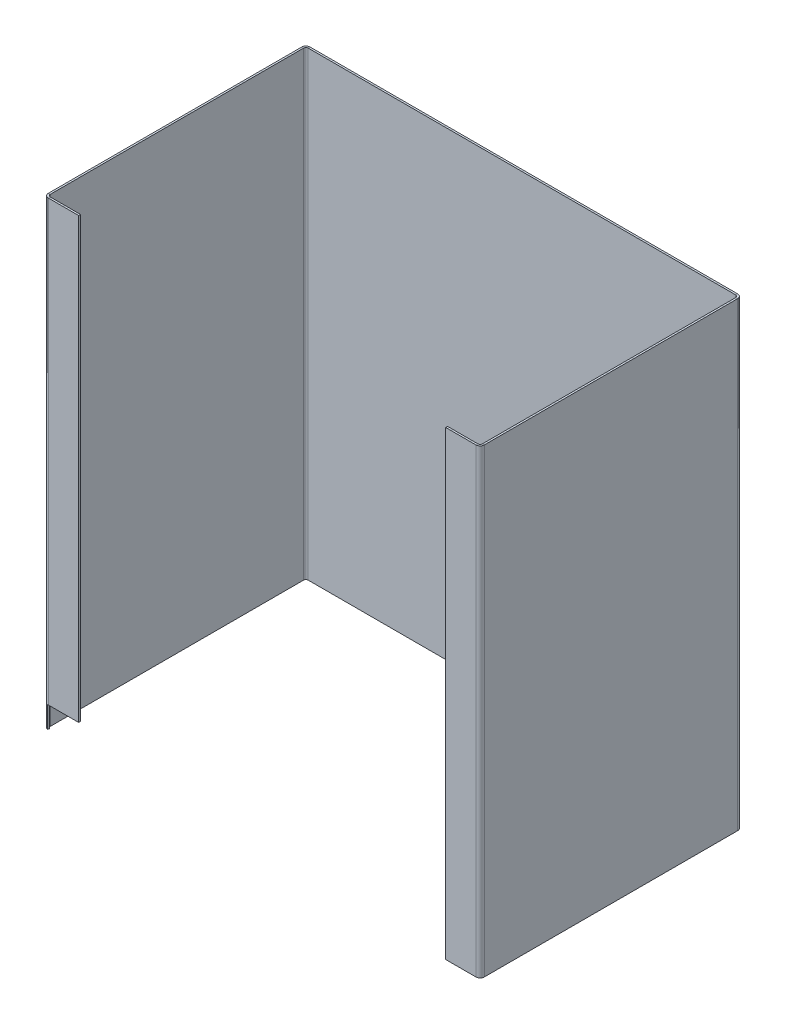
ISO-10303-21;
HEADER;
FILE_DESCRIPTION(('STEP AP214'),'2;1');
FILE_NAME('part.step','',(''),(''),'','','');
FILE_SCHEMA(('AUTOMOTIVE_DESIGN { 1 0 10303 214 1 1 1 1 }'));
ENDSEC;
DATA;
#1=APPLICATION_CONTEXT('core data for automotive mechanical design processes');
#2=APPLICATION_PROTOCOL_DEFINITION('international standard','automotive_design',2000,#1);
#3=PRODUCT_CONTEXT('',#1,'mechanical');
#4=PRODUCT('Part','Part','',(#3));
#5=PRODUCT_RELATED_PRODUCT_CATEGORY('part','',(#4));
#6=PRODUCT_DEFINITION_FORMATION('','',#4);
#7=PRODUCT_DEFINITION_CONTEXT('part definition',#1,'design');
#8=PRODUCT_DEFINITION('design','',#6,#7);
#9=PRODUCT_DEFINITION_SHAPE('','',#8);
#10=(LENGTH_UNIT() NAMED_UNIT(*) SI_UNIT(.MILLI.,.METRE.));
#11=(NAMED_UNIT(*) PLANE_ANGLE_UNIT() SI_UNIT($,.RADIAN.));
#12=(NAMED_UNIT(*) SI_UNIT($,.STERADIAN.) SOLID_ANGLE_UNIT());
#13=UNCERTAINTY_MEASURE_WITH_UNIT(LENGTH_MEASURE(1.E-05),#10,'distance_accuracy_value','');
#14=(GEOMETRIC_REPRESENTATION_CONTEXT(3) GLOBAL_UNCERTAINTY_ASSIGNED_CONTEXT((#13)) GLOBAL_UNIT_ASSIGNED_CONTEXT((#10,
#11,#12)) REPRESENTATION_CONTEXT('',''));
#15=CARTESIAN_POINT('',(0.,0.,0.));
#16=DIRECTION('',(0.,0.,1.));
#17=DIRECTION('',(1.,0.,0.));
#18=AXIS2_PLACEMENT_3D('',#15,#16,#17);
#19=CARTESIAN_POINT('',(0.,0.,0.));
#20=DIRECTION('',(0.,0.,-1.));
#21=DIRECTION('',(-1.,0.,0.));
#22=AXIS2_PLACEMENT_3D('',#19,#20,#21);
#23=PLANE('',#22);
#24=DIRECTION('',(-1.,0.,0.));
#25=VECTOR('',#24,1.);
#26=CARTESIAN_POINT('',(0.,148.,0.));
#27=LINE('',#26,#25);
#28=CARTESIAN_POINT('',(231.6634,148.,0.));
#29=VERTEX_POINT('',#28);
#30=CARTESIAN_POINT('',(94.3366,148.,0.));
#31=VERTEX_POINT('',#30);
#32=EDGE_CURVE('E378',#29,#31,#27,.T.);
#33=ORIENTED_EDGE('',*,*,#32,.F.);
#34=DIRECTION('',(0.,-1.,0.));
#35=VECTOR('',#34,1.);
#36=CARTESIAN_POINT('',(231.6634,0.,0.));
#37=LINE('',#36,#35);
#38=CARTESIAN_POINT('',(231.6634,0.,0.));
#39=VERTEX_POINT('',#38);
#40=EDGE_CURVE('E401',#29,#39,#37,.T.);
#41=ORIENTED_EDGE('',*,*,#40,.T.);
#42=DIRECTION('',(1.,0.,0.));
#43=VECTOR('',#42,1.);
#44=CARTESIAN_POINT('',(9.99999999999998,0.,0.));
#45=LINE('',#44,#43);
#46=CARTESIAN_POINT('',(94.3366,0.,0.));
#47=VERTEX_POINT('',#46);
#48=EDGE_CURVE('E410',#47,#39,#45,.T.);
#49=ORIENTED_EDGE('',*,*,#48,.F.);
#50=DIRECTION('',(0.,-1.,0.));
#51=VECTOR('',#50,1.);
#52=CARTESIAN_POINT('',(94.3366000000001,0.,0.));
#53=LINE('',#52,#51);
#54=EDGE_CURVE('E390',#31,#47,#53,.T.);
#55=ORIENTED_EDGE('',*,*,#54,.F.);
#56=EDGE_LOOP('',(#33,#41,#49,#55));
#57=FACE_BOUND('',#56,.T.);
#58=ADVANCED_FACE('F49',(#57),#23,.T.);
#59=CARTESIAN_POINT('',(0.,148.,0.6));
#60=DIRECTION('',(0.,-1.,0.));
#61=DIRECTION('',(0.,0.,-1.));
#62=AXIS2_PLACEMENT_3D('',#59,#60,#61);
#63=PLANE('',#62);
#64=DIRECTION('',(0.,0.,1.));
#65=VECTOR('',#64,1.);
#66=CARTESIAN_POINT('',(231.6634,148.,0.6));
#67=LINE('',#66,#65);
#68=CARTESIAN_POINT('',(231.6634,148.,0.599999999999998));
#69=VERTEX_POINT('',#68);
#70=EDGE_CURVE('E404',#29,#69,#67,.T.);
#71=ORIENTED_EDGE('',*,*,#70,.F.);
#72=ORIENTED_EDGE('',*,*,#32,.T.);
#73=DIRECTION('',(0.,0.,1.));
#74=VECTOR('',#73,1.);
#75=CARTESIAN_POINT('',(94.3366,148.,0.6));
#76=LINE('',#75,#74);
#77=CARTESIAN_POINT('',(94.3366,148.,0.600000000000005));
#78=VERTEX_POINT('',#77);
#79=EDGE_CURVE('E386',#31,#78,#76,.T.);
#80=ORIENTED_EDGE('',*,*,#79,.T.);
#81=DIRECTION('',(-1.,0.,0.));
#82=VECTOR('',#81,1.);
#83=CARTESIAN_POINT('',(0.,148.,0.6));
#84=LINE('',#83,#82);
#85=EDGE_CURVE('E412',#69,#78,#84,.T.);
#86=ORIENTED_EDGE('',*,*,#85,.F.);
#87=EDGE_LOOP('',(#71,#72,#80,#86));
#88=FACE_BOUND('',#87,.T.);
#89=ADVANCED_FACE('F476',(#88),#63,.F.);
#90=CARTESIAN_POINT('',(9.99999999999998,0.,0.6));
#91=DIRECTION('',(0.,1.,0.));
#92=DIRECTION('',(0.,0.,1.));
#93=AXIS2_PLACEMENT_3D('',#90,#91,#92);
#94=PLANE('',#93);
#95=DIRECTION('',(0.,0.,-1.));
#96=VECTOR('',#95,1.);
#97=CARTESIAN_POINT('',(231.6634,0.,0.6));
#98=LINE('',#97,#96);
#99=CARTESIAN_POINT('',(231.6634,0.,0.6));
#100=VERTEX_POINT('',#99);
#101=EDGE_CURVE('E398',#100,#39,#98,.T.);
#102=ORIENTED_EDGE('',*,*,#101,.F.);
#103=DIRECTION('',(1.,0.,0.));
#104=VECTOR('',#103,1.);
#105=CARTESIAN_POINT('',(9.99999999999998,0.,0.6));
#106=LINE('',#105,#104);
#107=CARTESIAN_POINT('',(94.3366000000001,0.,0.599999999999998));
#108=VERTEX_POINT('',#107);
#109=EDGE_CURVE('E387',#108,#100,#106,.T.);
#110=ORIENTED_EDGE('',*,*,#109,.F.);
#111=DIRECTION('',(0.,0.,-1.));
#112=VECTOR('',#111,1.);
#113=CARTESIAN_POINT('',(94.3366000000001,0.,0.6));
#114=LINE('',#113,#112);
#115=EDGE_CURVE('E392',#108,#47,#114,.T.);
#116=ORIENTED_EDGE('',*,*,#115,.T.);
#117=ORIENTED_EDGE('',*,*,#48,.T.);
#118=EDGE_LOOP('',(#102,#110,#116,#117));
#119=FACE_BOUND('',#118,.T.);
#120=ADVANCED_FACE('F464',(#119),#94,.F.);
#121=CARTESIAN_POINT('',(0.,0.,0.6));
#122=DIRECTION('',(0.,0.,-1.));
#123=DIRECTION('',(-1.,0.,0.));
#124=AXIS2_PLACEMENT_3D('',#121,#122,#123);
#125=PLANE('',#124);
#126=DIRECTION('',(0.,-1.,0.));
#127=VECTOR('',#126,1.);
#128=CARTESIAN_POINT('',(231.6634,0.,0.6));
#129=LINE('',#128,#127);
#130=EDGE_CURVE('E395',#69,#100,#129,.T.);
#131=ORIENTED_EDGE('',*,*,#130,.F.);
#132=ORIENTED_EDGE('',*,*,#85,.T.);
#133=DIRECTION('',(0.,-1.,0.));
#134=VECTOR('',#133,1.);
#135=CARTESIAN_POINT('',(94.3366000000001,0.,0.6));
#136=LINE('',#135,#134);
#137=EDGE_CURVE('E383',#78,#108,#136,.T.);
#138=ORIENTED_EDGE('',*,*,#137,.T.);
#139=ORIENTED_EDGE('',*,*,#109,.T.);
#140=EDGE_LOOP('',(#131,#132,#138,#139));
#141=FACE_BOUND('',#140,.T.);
#142=ADVANCED_FACE('F471',(#141),#125,.F.);
#143=CARTESIAN_POINT('',(94.3366,148.,1.3366));
#144=DIRECTION('',(0.,-1.,0.));
#145=DIRECTION('',(0.,0.,-1.));
#146=AXIS2_PLACEMENT_3D('',#143,#144,#145);
#147=PLANE('',#146);
#148=ORIENTED_EDGE('',*,*,#79,.F.);
#149=CARTESIAN_POINT('',(94.3366,148.,1.3366));
#150=DIRECTION('',(0.,-1.,0.));
#151=DIRECTION('',(1.,0.,0.));
#152=AXIS2_PLACEMENT_3D('',#149,#150,#151);
#153=CIRCLE('',#152,1.3366);
#154=CARTESIAN_POINT('',(93.0000000000001,148.,1.33660000000001));
#155=VERTEX_POINT('',#154);
#156=EDGE_CURVE('E280',#31,#155,#153,.F.);
#157=ORIENTED_EDGE('',*,*,#156,.T.);
#158=DIRECTION('',(1.,0.,0.));
#159=VECTOR('',#158,1.);
#160=CARTESIAN_POINT('',(93.6000000000001,148.,1.33660000000001));
#161=LINE('',#160,#159);
#162=CARTESIAN_POINT('',(93.6000000000001,148.,1.33660000000001));
#163=VERTEX_POINT('',#162);
#164=EDGE_CURVE('E363',#155,#163,#161,.T.);
#165=ORIENTED_EDGE('',*,*,#164,.T.);
#166=CARTESIAN_POINT('',(94.3366,148.,1.3366));
#167=DIRECTION('',(0.,1.,0.));
#168=DIRECTION('',(0.,0.,1.));
#169=AXIS2_PLACEMENT_3D('',#166,#167,#168);
#170=CIRCLE('',#169,0.736599999999995);
#171=EDGE_CURVE('E371',#78,#163,#170,.T.);
#172=ORIENTED_EDGE('',*,*,#171,.F.);
#173=EDGE_LOOP('',(#148,#157,#165,#172));
#174=FACE_BOUND('',#173,.T.);
#175=ADVANCED_FACE('F499',(#174),#147,.F.);
#176=CARTESIAN_POINT('',(94.3366000000001,0.,1.3366));
#177=DIRECTION('',(0.,1.,0.));
#178=DIRECTION('',(-1.,0.,0.));
#179=AXIS2_PLACEMENT_3D('',#176,#177,#178);
#180=PLANE('',#179);
#181=DIRECTION('',(-1.,0.,0.));
#182=VECTOR('',#181,1.);
#183=CARTESIAN_POINT('',(93.6000000000001,0.,1.33660000000001));
#184=LINE('',#183,#182);
#185=CARTESIAN_POINT('',(93.6000000000001,0.,1.3366));
#186=VERTEX_POINT('',#185);
#187=CARTESIAN_POINT('',(93.0000000000001,0.,1.33660000000001));
#188=VERTEX_POINT('',#187);
#189=EDGE_CURVE('E366',#186,#188,#184,.T.);
#190=ORIENTED_EDGE('',*,*,#189,.T.);
#191=CARTESIAN_POINT('',(94.3366000000001,0.,1.3366));
#192=DIRECTION('',(0.,-1.,0.));
#193=DIRECTION('',(1.,0.,0.));
#194=AXIS2_PLACEMENT_3D('',#191,#192,#193);
#195=CIRCLE('',#194,1.3366);
#196=EDGE_CURVE('E375',#188,#47,#195,.T.);
#197=ORIENTED_EDGE('',*,*,#196,.T.);
#198=ORIENTED_EDGE('',*,*,#115,.F.);
#199=CARTESIAN_POINT('',(94.3366000000001,0.,1.3366));
#200=DIRECTION('',(0.,-1.,0.));
#201=DIRECTION('',(1.,0.,0.));
#202=AXIS2_PLACEMENT_3D('',#199,#200,#201);
#203=CIRCLE('',#202,0.736600000000002);
#204=EDGE_CURVE('E374',#186,#108,#203,.T.);
#205=ORIENTED_EDGE('',*,*,#204,.F.);
#206=EDGE_LOOP('',(#190,#197,#198,#205));
#207=FACE_BOUND('',#206,.T.);
#208=ADVANCED_FACE('F485',(#207),#180,.F.);
#209=CARTESIAN_POINT('',(94.3366,222.010173029061,1.3366));
#210=DIRECTION('',(0.,-1.,0.));
#211=DIRECTION('',(1.,0.,0.));
#212=AXIS2_PLACEMENT_3D('',#209,#210,#211);
#213=CYLINDRICAL_SURFACE('',#212,0.7366);
#214=ORIENTED_EDGE('',*,*,#204,.T.);
#215=ORIENTED_EDGE('',*,*,#137,.F.);
#216=ORIENTED_EDGE('',*,*,#171,.T.);
#217=DIRECTION('',(0.,-1.,0.));
#218=VECTOR('',#217,1.);
#219=CARTESIAN_POINT('',(93.6000000000001,0.,1.33660000000001));
#220=LINE('',#219,#218);
#221=EDGE_CURVE('E273',#163,#186,#220,.T.);
#222=ORIENTED_EDGE('',*,*,#221,.T.);
#223=EDGE_LOOP('',(#214,#215,#216,#222));
#224=FACE_BOUND('',#223,.T.);
#225=ADVANCED_FACE('F496',(#224),#213,.F.);
#226=CARTESIAN_POINT('',(94.3366,222.010173029061,1.3366));
#227=DIRECTION('',(0.,-1.,0.));
#228=DIRECTION('',(1.,0.,0.));
#229=AXIS2_PLACEMENT_3D('',#226,#227,#228);
#230=CYLINDRICAL_SURFACE('',#229,1.3366);
#231=ORIENTED_EDGE('',*,*,#196,.F.);
#232=DIRECTION('',(0.,-1.,0.));
#233=VECTOR('',#232,1.);
#234=CARTESIAN_POINT('',(93.0000000000001,0.,1.33660000000001));
#235=LINE('',#234,#233);
#236=EDGE_CURVE('E284',#155,#188,#235,.T.);
#237=ORIENTED_EDGE('',*,*,#236,.F.);
#238=ORIENTED_EDGE('',*,*,#156,.F.);
#239=ORIENTED_EDGE('',*,*,#54,.T.);
#240=EDGE_LOOP('',(#231,#237,#238,#239));
#241=FACE_BOUND('',#240,.T.);
#242=ADVANCED_FACE('F482',(#241),#230,.T.);
#243=CARTESIAN_POINT('',(104.044912527645,7.00000000000001,83.4449125276443));
#244=DIRECTION('',(0.,1.,0.));
#245=DIRECTION('',(1.,0.,0.));
#246=AXIS2_PLACEMENT_3D('',#243,#244,#245);
#247=PLANE('',#246);
#248=DIRECTION('',(0.,0.,1.));
#249=VECTOR('',#248,1.);
#250=CARTESIAN_POINT('',(94.3366000000003,7.00000000000001,83.4449125276444));
#251=LINE('',#250,#249);
#252=CARTESIAN_POINT('',(94.3366000000004,7.00000000000001,83.4449125276444));
#253=VERTEX_POINT('',#252);
#254=CARTESIAN_POINT('',(94.3366000000004,7.00000000000001,84.0449125276444));
#255=VERTEX_POINT('',#254);
#256=EDGE_CURVE('E340',#253,#255,#251,.T.);
#257=ORIENTED_EDGE('',*,*,#256,.F.);
#258=DIRECTION('',(-1.,0.,0.));
#259=VECTOR('',#258,1.);
#260=CARTESIAN_POINT('',(104.044912527645,7.00000000000001,83.4449125276443));
#261=LINE('',#260,#259);
#262=CARTESIAN_POINT('',(104.044912527645,7.00000000000001,83.4449125276443));
#263=VERTEX_POINT('',#262);
#264=EDGE_CURVE('E328',#263,#253,#261,.T.);
#265=ORIENTED_EDGE('',*,*,#264,.F.);
#266=DIRECTION('',(0.,0.,1.));
#267=VECTOR('',#266,1.);
#268=CARTESIAN_POINT('',(104.044912527645,7.00000000000001,83.4449125276443));
#269=LINE('',#268,#267);
#270=CARTESIAN_POINT('',(104.044912527645,7.00000000000001,84.0449125276443));
#271=VERTEX_POINT('',#270);
#272=EDGE_CURVE('E360',#263,#271,#269,.T.);
#273=ORIENTED_EDGE('',*,*,#272,.T.);
#274=DIRECTION('',(-1.,0.,0.));
#275=VECTOR('',#274,1.);
#276=CARTESIAN_POINT('',(104.044912527645,7.00000000000001,84.0449125276443));
#277=LINE('',#276,#275);
#278=EDGE_CURVE('E358',#271,#255,#277,.T.);
#279=ORIENTED_EDGE('',*,*,#278,.T.);
#280=EDGE_LOOP('',(#257,#265,#273,#279));
#281=FACE_BOUND('',#280,.T.);
#282=ADVANCED_FACE('F539',(#281),#247,.F.);
#283=CARTESIAN_POINT('',(104.044912527645,7.00000000000001,83.4449125276443));
#284=DIRECTION('',(-1.,0.,0.));
#285=DIRECTION('',(0.,1.,0.));
#286=AXIS2_PLACEMENT_3D('',#283,#284,#285);
#287=PLANE('',#286);
#288=DIRECTION('',(0.,-1.,0.));
#289=VECTOR('',#288,1.);
#290=CARTESIAN_POINT('',(104.044912527645,7.00000000000001,84.0449125276443));
#291=LINE('',#290,#289);
#292=CARTESIAN_POINT('',(104.044912527645,148.,84.0449125276443));
#293=VERTEX_POINT('',#292);
#294=EDGE_CURVE('E356',#293,#271,#291,.T.);
#295=ORIENTED_EDGE('',*,*,#294,.T.);
#296=ORIENTED_EDGE('',*,*,#272,.F.);
#297=DIRECTION('',(0.,-1.,0.));
#298=VECTOR('',#297,1.);
#299=CARTESIAN_POINT('',(104.044912527645,7.00000000000001,83.4449125276443));
#300=LINE('',#299,#298);
#301=CARTESIAN_POINT('',(104.044912527645,148.,83.4449125276443));
#302=VERTEX_POINT('',#301);
#303=EDGE_CURVE('E331',#302,#263,#300,.T.);
#304=ORIENTED_EDGE('',*,*,#303,.F.);
#305=DIRECTION('',(0.,0.,1.));
#306=VECTOR('',#305,1.);
#307=CARTESIAN_POINT('',(104.044912527645,148.,83.4449125276443));
#308=LINE('',#307,#306);
#309=EDGE_CURVE('E353',#302,#293,#308,.T.);
#310=ORIENTED_EDGE('',*,*,#309,.T.);
#311=EDGE_LOOP('',(#295,#296,#304,#310));
#312=FACE_BOUND('',#311,.T.);
#313=ADVANCED_FACE('F543',(#312),#287,.F.);
#314=CARTESIAN_POINT('',(104.044912527645,0.,84.0449125276443));
#315=DIRECTION('',(0.,0.,1.));
#316=DIRECTION('',(1.,0.,0.));
#317=AXIS2_PLACEMENT_3D('',#314,#315,#316);
#318=PLANE('',#317);
#319=DIRECTION('',(1.,0.,0.));
#320=VECTOR('',#319,1.);
#321=CARTESIAN_POINT('',(104.044912527645,148.,84.0449125276443));
#322=LINE('',#321,#320);
#323=CARTESIAN_POINT('',(94.3366000000003,148.,84.0449125276444));
#324=VERTEX_POINT('',#323);
#325=EDGE_CURVE('E348',#324,#293,#322,.T.);
#326=ORIENTED_EDGE('',*,*,#325,.F.);
#327=DIRECTION('',(0.,-1.,0.));
#328=VECTOR('',#327,1.);
#329=CARTESIAN_POINT('',(94.3366000000004,0.,84.0449125276444));
#330=LINE('',#329,#328);
#331=EDGE_CURVE('E350',#324,#255,#330,.T.);
#332=ORIENTED_EDGE('',*,*,#331,.T.);
#333=ORIENTED_EDGE('',*,*,#278,.F.);
#334=ORIENTED_EDGE('',*,*,#294,.F.);
#335=EDGE_LOOP('',(#326,#332,#333,#334));
#336=FACE_BOUND('',#335,.T.);
#337=ADVANCED_FACE('F541',(#336),#318,.T.);
#338=CARTESIAN_POINT('',(104.044912527645,148.,83.4449125276443));
#339=DIRECTION('',(0.,-1.,0.));
#340=DIRECTION('',(0.,0.,1.));
#341=AXIS2_PLACEMENT_3D('',#338,#339,#340);
#342=PLANE('',#341);
#343=DIRECTION('',(0.,0.,-1.));
#344=VECTOR('',#343,1.);
#345=CARTESIAN_POINT('',(94.3366000000003,148.,83.4449125276444));
#346=LINE('',#345,#344);
#347=CARTESIAN_POINT('',(94.3366000000003,148.,83.4449125276444));
#348=VERTEX_POINT('',#347);
#349=EDGE_CURVE('E317',#324,#348,#346,.T.);
#350=ORIENTED_EDGE('',*,*,#349,.F.);
#351=ORIENTED_EDGE('',*,*,#325,.T.);
#352=ORIENTED_EDGE('',*,*,#309,.F.);
#353=DIRECTION('',(1.,0.,0.));
#354=VECTOR('',#353,1.);
#355=CARTESIAN_POINT('',(104.044912527645,148.,83.4449125276443));
#356=LINE('',#355,#354);
#357=EDGE_CURVE('E333',#348,#302,#356,.T.);
#358=ORIENTED_EDGE('',*,*,#357,.F.);
#359=EDGE_LOOP('',(#350,#351,#352,#358));
#360=FACE_BOUND('',#359,.T.);
#361=ADVANCED_FACE('F531',(#360),#342,.F.);
#362=CARTESIAN_POINT('',(94.1320535833874,3.50000000000001,83.4159426029315));
#363=DIRECTION('',(-0.960670751136404,0.,-0.277689949243788));
#364=DIRECTION('',(0.,-1.,0.));
#365=AXIS2_PLACEMENT_3D('',#362,#363,#364);
#366=PLANE('',#365);
#367=DIRECTION('',(0.277689949243795,0.,-0.960670751136402));
#368=VECTOR('',#367,1.);
#369=CARTESIAN_POINT('',(94.1320535833874,7.00000000000001,83.4159426029315));
#370=LINE('',#369,#368);
#371=CARTESIAN_POINT('',(93.9654396138411,7.00000000000001,83.9923450536133));
#372=VERTEX_POINT('',#371);
#373=CARTESIAN_POINT('',(94.1320535833874,7.00000000000001,83.4159426029315));
#374=VERTEX_POINT('',#373);
#375=EDGE_CURVE('E335',#372,#374,#370,.T.);
#376=ORIENTED_EDGE('',*,*,#375,.F.);
#377=DIRECTION('',(0.,-1.,0.));
#378=VECTOR('',#377,1.);
#379=CARTESIAN_POINT('',(93.9654396138411,222.010173029061,83.9923450536133));
#380=LINE('',#379,#378);
#381=CARTESIAN_POINT('',(93.9654396138411,0.,83.9923450536133));
#382=VERTEX_POINT('',#381);
#383=EDGE_CURVE('E345',#372,#382,#380,.T.);
#384=ORIENTED_EDGE('',*,*,#383,.T.);
#385=DIRECTION('',(0.277689949243781,0.,-0.960670751136406));
#386=VECTOR('',#385,1.);
#387=CARTESIAN_POINT('',(94.1320535833874,0.,83.4159426029315));
#388=LINE('',#387,#386);
#389=CARTESIAN_POINT('',(94.1320535833874,0.,83.4159426029315));
#390=VERTEX_POINT('',#389);
#391=EDGE_CURVE('E343',#382,#390,#388,.T.);
#392=ORIENTED_EDGE('',*,*,#391,.T.);
#393=DIRECTION('',(0.,-1.,0.));
#394=VECTOR('',#393,1.);
#395=CARTESIAN_POINT('',(94.1320535833874,7.00000000000001,83.4159426029315));
#396=LINE('',#395,#394);
#397=EDGE_CURVE('E302',#374,#390,#396,.T.);
#398=ORIENTED_EDGE('',*,*,#397,.F.);
#399=EDGE_LOOP('',(#376,#384,#392,#398));
#400=FACE_BOUND('',#399,.T.);
#401=ADVANCED_FACE('F517',(#400),#366,.F.);
#402=CARTESIAN_POINT('',(94.3366000000004,7.00000000000001,82.7083125276444));
#403=DIRECTION('',(0.,1.,0.));
#404=DIRECTION('',(1.,0.,0.));
#405=AXIS2_PLACEMENT_3D('',#402,#403,#404);
#406=PLANE('',#405);
#407=ORIENTED_EDGE('',*,*,#256,.T.);
#408=CARTESIAN_POINT('',(94.3366000000004,7.00000000000001,82.7083125276444));
#409=DIRECTION('',(0.,-1.,0.));
#410=DIRECTION('',(0.,0.,-1.));
#411=AXIS2_PLACEMENT_3D('',#408,#409,#410);
#412=CIRCLE('',#411,1.3366);
#413=EDGE_CURVE('E337',#255,#372,#412,.T.);
#414=ORIENTED_EDGE('',*,*,#413,.T.);
#415=ORIENTED_EDGE('',*,*,#375,.T.);
#416=CARTESIAN_POINT('',(94.3366000000004,7.00000000000001,82.7083125276444));
#417=DIRECTION('',(0.,-1.,0.));
#418=DIRECTION('',(-1.,0.,0.));
#419=AXIS2_PLACEMENT_3D('',#416,#417,#418);
#420=CIRCLE('',#419,0.7366);
#421=EDGE_CURVE('E305',#253,#374,#420,.T.);
#422=ORIENTED_EDGE('',*,*,#421,.F.);
#423=EDGE_LOOP('',(#407,#414,#415,#422));
#424=FACE_BOUND('',#423,.T.);
#425=ADVANCED_FACE('F522',(#424),#406,.F.);
#426=CARTESIAN_POINT('',(104.044912527645,0.,83.4449125276443));
#427=DIRECTION('',(0.,0.,1.));
#428=DIRECTION('',(1.,0.,0.));
#429=AXIS2_PLACEMENT_3D('',#426,#427,#428);
#430=PLANE('',#429);
#431=DIRECTION('',(0.,-1.,0.));
#432=VECTOR('',#431,1.);
#433=CARTESIAN_POINT('',(94.3366000000003,0.,83.4449125276444));
#434=LINE('',#433,#432);
#435=EDGE_CURVE('E308',#348,#253,#434,.T.);
#436=ORIENTED_EDGE('',*,*,#435,.F.);
#437=ORIENTED_EDGE('',*,*,#357,.T.);
#438=ORIENTED_EDGE('',*,*,#303,.T.);
#439=ORIENTED_EDGE('',*,*,#264,.T.);
#440=EDGE_LOOP('',(#436,#437,#438,#439));
#441=FACE_BOUND('',#440,.T.);
#442=ADVANCED_FACE('F535',(#441),#430,.F.);
#443=CARTESIAN_POINT('',(94.3366000000004,0.,82.7083125276444));
#444=DIRECTION('',(0.,1.,0.));
#445=DIRECTION('',(0.,0.,1.));
#446=AXIS2_PLACEMENT_3D('',#443,#444,#445);
#447=PLANE('',#446);
#448=ORIENTED_EDGE('',*,*,#391,.F.);
#449=CARTESIAN_POINT('',(94.3366000000004,0.,82.7083125276444));
#450=DIRECTION('',(0.,-1.,0.));
#451=DIRECTION('',(0.,0.,-1.));
#452=AXIS2_PLACEMENT_3D('',#449,#450,#451);
#453=CIRCLE('',#452,1.3366);
#454=CARTESIAN_POINT('',(93.0000000000003,0.,82.7083125276444));
#455=VERTEX_POINT('',#454);
#456=EDGE_CURVE('E325',#382,#455,#453,.T.);
#457=ORIENTED_EDGE('',*,*,#456,.T.);
#458=DIRECTION('',(-1.,0.,0.));
#459=VECTOR('',#458,1.);
#460=CARTESIAN_POINT('',(93.6000000000003,0.,82.7083125276444));
#461=LINE('',#460,#459);
#462=CARTESIAN_POINT('',(93.6000000000003,0.,82.7083125276444));
#463=VERTEX_POINT('',#462);
#464=EDGE_CURVE('E281',#463,#455,#461,.T.);
#465=ORIENTED_EDGE('',*,*,#464,.F.);
#466=CARTESIAN_POINT('',(94.3366000000004,0.,82.7083125276444));
#467=DIRECTION('',(0.,-1.,0.));
#468=DIRECTION('',(0.,0.,-1.));
#469=AXIS2_PLACEMENT_3D('',#466,#467,#468);
#470=CIRCLE('',#469,0.7366);
#471=EDGE_CURVE('E314',#390,#463,#470,.T.);
#472=ORIENTED_EDGE('',*,*,#471,.F.);
#473=EDGE_LOOP('',(#448,#457,#465,#472));
#474=FACE_BOUND('',#473,.T.);
#475=ADVANCED_FACE('F513',(#474),#447,.F.);
#476=CARTESIAN_POINT('',(94.3366000000003,222.010173029061,82.7083125276444));
#477=DIRECTION('',(0.,-1.,0.));
#478=DIRECTION('',(0.,0.,-1.));
#479=AXIS2_PLACEMENT_3D('',#476,#477,#478);
#480=CYLINDRICAL_SURFACE('',#479,1.3366);
#481=ORIENTED_EDGE('',*,*,#456,.F.);
#482=ORIENTED_EDGE('',*,*,#383,.F.);
#483=ORIENTED_EDGE('',*,*,#413,.F.);
#484=ORIENTED_EDGE('',*,*,#331,.F.);
#485=CARTESIAN_POINT('',(94.3366000000003,148.,82.7083125276444));
#486=DIRECTION('',(0.,-1.,0.));
#487=DIRECTION('',(0.,0.,-1.));
#488=AXIS2_PLACEMENT_3D('',#485,#486,#487);
#489=CIRCLE('',#488,1.3366);
#490=CARTESIAN_POINT('',(93.0000000000003,148.,82.7083125276444));
#491=VERTEX_POINT('',#490);
#492=EDGE_CURVE('E320',#491,#324,#489,.F.);
#493=ORIENTED_EDGE('',*,*,#492,.F.);
#494=DIRECTION('',(0.,-1.,0.));
#495=VECTOR('',#494,1.);
#496=CARTESIAN_POINT('',(93.0000000000003,0.,82.7083125276444));
#497=LINE('',#496,#495);
#498=EDGE_CURVE('E323',#491,#455,#497,.T.);
#499=ORIENTED_EDGE('',*,*,#498,.T.);
#500=EDGE_LOOP('',(#481,#482,#483,#484,#493,#499));
#501=FACE_BOUND('',#500,.T.);
#502=ADVANCED_FACE('F509',(#501),#480,.T.);
#503=CARTESIAN_POINT('',(94.3366000000003,148.,82.7083125276444));
#504=DIRECTION('',(0.,-1.,0.));
#505=DIRECTION('',(-1.,0.,0.));
#506=AXIS2_PLACEMENT_3D('',#503,#504,#505);
#507=PLANE('',#506);
#508=DIRECTION('',(1.,0.,0.));
#509=VECTOR('',#508,1.);
#510=CARTESIAN_POINT('',(93.6000000000003,148.,82.7083125276444));
#511=LINE('',#510,#509);
#512=CARTESIAN_POINT('',(93.6000000000003,148.,82.7083125276444));
#513=VERTEX_POINT('',#512);
#514=EDGE_CURVE('E287',#491,#513,#511,.T.);
#515=ORIENTED_EDGE('',*,*,#514,.F.);
#516=ORIENTED_EDGE('',*,*,#492,.T.);
#517=ORIENTED_EDGE('',*,*,#349,.T.);
#518=CARTESIAN_POINT('',(94.3366000000003,148.,82.7083125276444));
#519=DIRECTION('',(0.,1.,0.));
#520=DIRECTION('',(1.,0.,0.));
#521=AXIS2_PLACEMENT_3D('',#518,#519,#520);
#522=CIRCLE('',#521,0.7366);
#523=EDGE_CURVE('E311',#513,#348,#522,.T.);
#524=ORIENTED_EDGE('',*,*,#523,.F.);
#525=EDGE_LOOP('',(#515,#516,#517,#524));
#526=FACE_BOUND('',#525,.T.);
#527=ADVANCED_FACE('F527',(#526),#507,.F.);
#528=CARTESIAN_POINT('',(94.3366000000003,222.010173029061,82.7083125276444));
#529=DIRECTION('',(0.,-1.,0.));
#530=DIRECTION('',(0.,0.,-1.));
#531=AXIS2_PLACEMENT_3D('',#528,#529,#530);
#532=CYLINDRICAL_SURFACE('',#531,0.7366);
#533=ORIENTED_EDGE('',*,*,#471,.T.);
#534=DIRECTION('',(0.,-1.,0.));
#535=VECTOR('',#534,1.);
#536=CARTESIAN_POINT('',(93.6000000000003,0.,82.7083125276444));
#537=LINE('',#536,#535);
#538=EDGE_CURVE('E296',#513,#463,#537,.T.);
#539=ORIENTED_EDGE('',*,*,#538,.F.);
#540=ORIENTED_EDGE('',*,*,#523,.T.);
#541=ORIENTED_EDGE('',*,*,#435,.T.);
#542=ORIENTED_EDGE('',*,*,#421,.T.);
#543=ORIENTED_EDGE('',*,*,#397,.T.);
#544=EDGE_LOOP('',(#533,#539,#540,#541,#542,#543));
#545=FACE_BOUND('',#544,.T.);
#546=ADVANCED_FACE('F519',(#545),#532,.F.);
#547=CARTESIAN_POINT('',(93.6000000000004,0.,94.0449125276445));
#548=DIRECTION('',(-1.,0.,0.));
#549=DIRECTION('',(0.,0.,1.));
#550=AXIS2_PLACEMENT_3D('',#547,#548,#549);
#551=PLANE('',#550);
#552=ORIENTED_EDGE('',*,*,#221,.F.);
#553=DIRECTION('',(0.,0.,1.));
#554=VECTOR('',#553,1.);
#555=CARTESIAN_POINT('',(93.6000000000004,148.,94.0449125276444));
#556=LINE('',#555,#554);
#557=EDGE_CURVE('E299',#163,#513,#556,.T.);
#558=ORIENTED_EDGE('',*,*,#557,.T.);
#559=ORIENTED_EDGE('',*,*,#538,.T.);
#560=DIRECTION('',(0.,0.,-1.));
#561=VECTOR('',#560,1.);
#562=CARTESIAN_POINT('',(93.6000000000003,0.,84.0449125276445));
#563=LINE('',#562,#561);
#564=EDGE_CURVE('E293',#463,#186,#563,.T.);
#565=ORIENTED_EDGE('',*,*,#564,.T.);
#566=EDGE_LOOP('',(#552,#558,#559,#565));
#567=FACE_BOUND('',#566,.T.);
#568=ADVANCED_FACE('F492',(#567),#551,.F.);
#569=CARTESIAN_POINT('',(93.6000000000004,148.,94.0449125276444));
#570=DIRECTION('',(0.,-1.,0.));
#571=DIRECTION('',(-1.,0.,0.));
#572=AXIS2_PLACEMENT_3D('',#569,#570,#571);
#573=PLANE('',#572);
#574=ORIENTED_EDGE('',*,*,#164,.F.);
#575=DIRECTION('',(0.,0.,1.));
#576=VECTOR('',#575,1.);
#577=CARTESIAN_POINT('',(93.0000000000004,148.,94.0449125276444));
#578=LINE('',#577,#576);
#579=EDGE_CURVE('E290',#155,#491,#578,.T.);
#580=ORIENTED_EDGE('',*,*,#579,.T.);
#581=ORIENTED_EDGE('',*,*,#514,.T.);
#582=ORIENTED_EDGE('',*,*,#557,.F.);
#583=EDGE_LOOP('',(#574,#580,#581,#582));
#584=FACE_BOUND('',#583,.T.);
#585=ADVANCED_FACE('F502',(#584),#573,.F.);
#586=CARTESIAN_POINT('',(93.0000000000004,0.,94.0449125276445));
#587=DIRECTION('',(-1.,0.,0.));
#588=DIRECTION('',(0.,0.,1.));
#589=AXIS2_PLACEMENT_3D('',#586,#587,#588);
#590=PLANE('',#589);
#591=ORIENTED_EDGE('',*,*,#579,.F.);
#592=ORIENTED_EDGE('',*,*,#236,.T.);
#593=DIRECTION('',(0.,0.,-1.));
#594=VECTOR('',#593,1.);
#595=CARTESIAN_POINT('',(93.0000000000003,0.,84.0449125276445));
#596=LINE('',#595,#594);
#597=EDGE_CURVE('E278',#455,#188,#596,.T.);
#598=ORIENTED_EDGE('',*,*,#597,.F.);
#599=ORIENTED_EDGE('',*,*,#498,.F.);
#600=EDGE_LOOP('',(#591,#592,#598,#599));
#601=FACE_BOUND('',#600,.T.);
#602=ADVANCED_FACE('F505',(#601),#590,.T.);
#603=CARTESIAN_POINT('',(93.6000000000003,0.,84.0449125276445));
#604=DIRECTION('',(0.,1.,0.));
#605=DIRECTION('',(1.,0.,0.));
#606=AXIS2_PLACEMENT_3D('',#603,#604,#605);
#607=PLANE('',#606);
#608=ORIENTED_EDGE('',*,*,#189,.F.);
#609=ORIENTED_EDGE('',*,*,#564,.F.);
#610=ORIENTED_EDGE('',*,*,#464,.T.);
#611=ORIENTED_EDGE('',*,*,#597,.T.);
#612=EDGE_LOOP('',(#608,#609,#610,#611));
#613=FACE_BOUND('',#612,.T.);
#614=ADVANCED_FACE('F489',(#613),#607,.F.);
#615=CARTESIAN_POINT('',(231.6634,148.,1.3366));
#616=DIRECTION('',(0.,-1.,0.));
#617=DIRECTION('',(0.,0.,-1.));
#618=AXIS2_PLACEMENT_3D('',#615,#616,#617);
#619=PLANE('',#618);
#620=DIRECTION('',(-1.,0.,0.));
#621=VECTOR('',#620,1.);
#622=CARTESIAN_POINT('',(232.4,148.,1.33659999999999));
#623=LINE('',#622,#621);
#624=CARTESIAN_POINT('',(233.,148.,1.33659999999999));
#625=VERTEX_POINT('',#624);
#626=CARTESIAN_POINT('',(232.4,148.,1.33660000000001));
#627=VERTEX_POINT('',#626);
#628=EDGE_CURVE('E256',#625,#627,#623,.T.);
#629=ORIENTED_EDGE('',*,*,#628,.F.);
#630=CARTESIAN_POINT('',(231.6634,148.,1.3366));
#631=DIRECTION('',(0.,1.,0.));
#632=DIRECTION('',(0.,0.,1.));
#633=AXIS2_PLACEMENT_3D('',#630,#631,#632);
#634=CIRCLE('',#633,1.3366);
#635=EDGE_CURVE('E258',#625,#29,#634,.T.);
#636=ORIENTED_EDGE('',*,*,#635,.T.);
#637=ORIENTED_EDGE('',*,*,#70,.T.);
#638=CARTESIAN_POINT('',(231.6634,148.,1.3366));
#639=DIRECTION('',(0.,1.,0.));
#640=DIRECTION('',(0.,0.,1.));
#641=AXIS2_PLACEMENT_3D('',#638,#639,#640);
#642=CIRCLE('',#641,0.736600000000002);
#643=EDGE_CURVE('E266',#627,#69,#642,.T.);
#644=ORIENTED_EDGE('',*,*,#643,.F.);
#645=EDGE_LOOP('',(#629,#636,#637,#644));
#646=FACE_BOUND('',#645,.T.);
#647=ADVANCED_FACE('F474',(#646),#619,.F.);
#648=CARTESIAN_POINT('',(231.6634,0.,1.3366));
#649=DIRECTION('',(0.,1.,0.));
#650=DIRECTION('',(0.,0.,1.));
#651=AXIS2_PLACEMENT_3D('',#648,#649,#650);
#652=PLANE('',#651);
#653=CARTESIAN_POINT('',(231.6634,0.,1.3366));
#654=DIRECTION('',(0.,1.,0.));
#655=DIRECTION('',(0.,0.,1.));
#656=AXIS2_PLACEMENT_3D('',#653,#654,#655);
#657=CIRCLE('',#656,1.3366);
#658=CARTESIAN_POINT('',(233.,0.,1.33659999999999));
#659=VERTEX_POINT('',#658);
#660=EDGE_CURVE('E270',#39,#659,#657,.F.);
#661=ORIENTED_EDGE('',*,*,#660,.T.);
#662=DIRECTION('',(1.,0.,0.));
#663=VECTOR('',#662,1.);
#664=CARTESIAN_POINT('',(232.4,0.,1.33659999999999));
#665=LINE('',#664,#663);
#666=CARTESIAN_POINT('',(232.4,0.,1.33659999999999));
#667=VERTEX_POINT('',#666);
#668=EDGE_CURVE('E259',#667,#659,#665,.T.);
#669=ORIENTED_EDGE('',*,*,#668,.F.);
#670=CARTESIAN_POINT('',(231.6634,0.,1.3366));
#671=DIRECTION('',(0.,-1.,0.));
#672=DIRECTION('',(0.,0.,-1.));
#673=AXIS2_PLACEMENT_3D('',#670,#671,#672);
#674=CIRCLE('',#673,0.736600000000002);
#675=EDGE_CURVE('E269',#100,#667,#674,.T.);
#676=ORIENTED_EDGE('',*,*,#675,.F.);
#677=ORIENTED_EDGE('',*,*,#101,.T.);
#678=EDGE_LOOP('',(#661,#669,#676,#677));
#679=FACE_BOUND('',#678,.T.);
#680=ADVANCED_FACE('F460',(#679),#652,.F.);
#681=CARTESIAN_POINT('',(231.6634,-74.0101730290612,1.3366));
#682=DIRECTION('',(0.,1.,0.));
#683=DIRECTION('',(0.,0.,1.));
#684=AXIS2_PLACEMENT_3D('',#681,#682,#683);
#685=CYLINDRICAL_SURFACE('',#684,0.7366);
#686=ORIENTED_EDGE('',*,*,#130,.T.);
#687=ORIENTED_EDGE('',*,*,#675,.T.);
#688=DIRECTION('',(0.,-1.,0.));
#689=VECTOR('',#688,1.);
#690=CARTESIAN_POINT('',(232.4,0.,1.33659999999999));
#691=LINE('',#690,#689);
#692=EDGE_CURVE('E262',#627,#667,#691,.T.);
#693=ORIENTED_EDGE('',*,*,#692,.F.);
#694=ORIENTED_EDGE('',*,*,#643,.T.);
#695=EDGE_LOOP('',(#686,#687,#693,#694));
#696=FACE_BOUND('',#695,.T.);
#697=ADVANCED_FACE('F468',(#696),#685,.F.);
#698=CARTESIAN_POINT('',(231.6634,-74.0101730290612,1.3366));
#699=DIRECTION('',(0.,1.,0.));
#700=DIRECTION('',(0.,0.,1.));
#701=AXIS2_PLACEMENT_3D('',#698,#699,#700);
#702=CYLINDRICAL_SURFACE('',#701,1.3366);
#703=ORIENTED_EDGE('',*,*,#40,.F.);
#704=ORIENTED_EDGE('',*,*,#635,.F.);
#705=DIRECTION('',(0.,-1.,0.));
#706=VECTOR('',#705,1.);
#707=CARTESIAN_POINT('',(233.,0.,1.33659999999999));
#708=LINE('',#707,#706);
#709=EDGE_CURVE('E252',#625,#659,#708,.T.);
#710=ORIENTED_EDGE('',*,*,#709,.T.);
#711=ORIENTED_EDGE('',*,*,#660,.F.);
#712=EDGE_LOOP('',(#703,#704,#710,#711));
#713=FACE_BOUND('',#712,.T.);
#714=ADVANCED_FACE('F459',(#713),#702,.T.);
#715=CARTESIAN_POINT('',(232.400000000001,0.,-231.955087472356));
#716=DIRECTION('',(1.,0.,0.));
#717=DIRECTION('',(0.,0.,-1.));
#718=AXIS2_PLACEMENT_3D('',#715,#716,#717);
#719=PLANE('',#718);
#720=DIRECTION('',(0.,-1.,0.));
#721=VECTOR('',#720,1.);
#722=CARTESIAN_POINT('',(232.4,1.18022483677985E-13,82.7083125276444));
#723=LINE('',#722,#721);
#724=CARTESIAN_POINT('',(232.4,148.,82.7083125276444));
#725=VERTEX_POINT('',#724);
#726=CARTESIAN_POINT('',(232.4,0.,82.7083125276444));
#727=VERTEX_POINT('',#726);
#728=EDGE_CURVE('E407',#725,#727,#723,.T.);
#729=ORIENTED_EDGE('',*,*,#728,.F.);
#730=DIRECTION('',(0.,0.,-1.));
#731=VECTOR('',#730,1.);
#732=CARTESIAN_POINT('',(232.400000000001,148.,-231.955087472356));
#733=LINE('',#732,#731);
#734=EDGE_CURVE('E53',#725,#627,#733,.T.);
#735=ORIENTED_EDGE('',*,*,#734,.T.);
#736=ORIENTED_EDGE('',*,*,#692,.T.);
#737=DIRECTION('',(0.,0.,1.));
#738=VECTOR('',#737,1.);
#739=CARTESIAN_POINT('',(232.400000000001,0.,-221.955087472356));
#740=LINE('',#739,#738);
#741=EDGE_CURVE('E261',#667,#727,#740,.T.);
#742=ORIENTED_EDGE('',*,*,#741,.T.);
#743=EDGE_LOOP('',(#729,#735,#736,#742));
#744=FACE_BOUND('',#743,.T.);
#745=ADVANCED_FACE('F426',(#744),#719,.F.);
#746=CARTESIAN_POINT('',(232.400000000001,0.,-221.955087472356));
#747=DIRECTION('',(0.,1.,0.));
#748=DIRECTION('',(-1.,0.,0.));
#749=AXIS2_PLACEMENT_3D('',#746,#747,#748);
#750=PLANE('',#749);
#751=DIRECTION('',(1.,0.,0.));
#752=VECTOR('',#751,1.);
#753=CARTESIAN_POINT('',(232.4,0.,82.7083125276444));
#754=LINE('',#753,#752);
#755=CARTESIAN_POINT('',(233.,0.,82.7083125276444));
#756=VERTEX_POINT('',#755);
#757=EDGE_CURVE('E418',#727,#756,#754,.T.);
#758=ORIENTED_EDGE('',*,*,#757,.F.);
#759=ORIENTED_EDGE('',*,*,#741,.F.);
#760=ORIENTED_EDGE('',*,*,#668,.T.);
#761=DIRECTION('',(0.,0.,1.));
#762=VECTOR('',#761,1.);
#763=CARTESIAN_POINT('',(233.000000000001,0.,-221.955087472356));
#764=LINE('',#763,#762);
#765=EDGE_CURVE('E74',#659,#756,#764,.T.);
#766=ORIENTED_EDGE('',*,*,#765,.T.);
#767=EDGE_LOOP('',(#758,#759,#760,#766));
#768=FACE_BOUND('',#767,.T.);
#769=ADVANCED_FACE('F430',(#768),#750,.F.);
#770=CARTESIAN_POINT('',(233.000000000001,0.,-231.955087472356));
#771=DIRECTION('',(1.,0.,0.));
#772=DIRECTION('',(0.,0.,-1.));
#773=AXIS2_PLACEMENT_3D('',#770,#771,#772);
#774=PLANE('',#773);
#775=DIRECTION('',(0.,0.,-1.));
#776=VECTOR('',#775,1.);
#777=CARTESIAN_POINT('',(233.000000000001,148.,-231.955087472356));
#778=LINE('',#777,#776);
#779=CARTESIAN_POINT('',(233.,148.,82.7083125276444));
#780=VERTEX_POINT('',#779);
#781=EDGE_CURVE('E66',#780,#625,#778,.T.);
#782=ORIENTED_EDGE('',*,*,#781,.F.);
#783=DIRECTION('',(0.,-1.,0.));
#784=VECTOR('',#783,1.);
#785=CARTESIAN_POINT('',(233.,1.18022483677985E-13,82.7083125276444));
#786=LINE('',#785,#784);
#787=EDGE_CURVE('E58',#780,#756,#786,.T.);
#788=ORIENTED_EDGE('',*,*,#787,.T.);
#789=ORIENTED_EDGE('',*,*,#765,.F.);
#790=ORIENTED_EDGE('',*,*,#709,.F.);
#791=EDGE_LOOP('',(#782,#788,#789,#790));
#792=FACE_BOUND('',#791,.T.);
#793=ADVANCED_FACE('F451',(#792),#774,.T.);
#794=CARTESIAN_POINT('',(232.400000000001,148.,-231.955087472356));
#795=DIRECTION('',(0.,-1.,0.));
#796=DIRECTION('',(1.,0.,0.));
#797=AXIS2_PLACEMENT_3D('',#794,#795,#796);
#798=PLANE('',#797);
#799=DIRECTION('',(-1.,0.,0.));
#800=VECTOR('',#799,1.);
#801=CARTESIAN_POINT('',(232.4,148.,82.7083125276444));
#802=LINE('',#801,#800);
#803=EDGE_CURVE('E12',#780,#725,#802,.T.);
#804=ORIENTED_EDGE('',*,*,#803,.F.);
#805=ORIENTED_EDGE('',*,*,#781,.T.);
#806=ORIENTED_EDGE('',*,*,#628,.T.);
#807=ORIENTED_EDGE('',*,*,#734,.F.);
#808=EDGE_LOOP('',(#804,#805,#806,#807));
#809=FACE_BOUND('',#808,.T.);
#810=ADVANCED_FACE('F51',(#809),#798,.F.);
#811=CARTESIAN_POINT('',(231.6634,148.,82.7083125276444));
#812=DIRECTION('',(0.,-1.,0.));
#813=DIRECTION('',(0.,0.,-1.));
#814=AXIS2_PLACEMENT_3D('',#811,#812,#813);
#815=PLANE('',#814);
#816=DIRECTION('',(0.,0.,-1.));
#817=VECTOR('',#816,1.);
#818=CARTESIAN_POINT('',(231.6634,148.,83.4449125276443));
#819=LINE('',#818,#817);
#820=CARTESIAN_POINT('',(231.6634,148.,84.0449125276443));
#821=VERTEX_POINT('',#820);
#822=CARTESIAN_POINT('',(231.6634,148.,83.4449125276443));
#823=VERTEX_POINT('',#822);
#824=EDGE_CURVE('E208',#821,#823,#819,.T.);
#825=ORIENTED_EDGE('',*,*,#824,.F.);
#826=CARTESIAN_POINT('',(231.6634,148.,82.7083125276444));
#827=DIRECTION('',(0.,1.,0.));
#828=DIRECTION('',(0.,0.,1.));
#829=AXIS2_PLACEMENT_3D('',#826,#827,#828);
#830=CIRCLE('',#829,1.3366);
#831=EDGE_CURVE('E227',#821,#780,#830,.T.);
#832=ORIENTED_EDGE('',*,*,#831,.T.);
#833=ORIENTED_EDGE('',*,*,#803,.T.);
#834=CARTESIAN_POINT('',(231.6634,148.,82.7083125276444));
#835=DIRECTION('',(0.,1.,0.));
#836=DIRECTION('',(0.,0.,1.));
#837=AXIS2_PLACEMENT_3D('',#834,#835,#836);
#838=CIRCLE('',#837,0.736600000000004);
#839=EDGE_CURVE('E247',#823,#725,#838,.T.);
#840=ORIENTED_EDGE('',*,*,#839,.F.);
#841=EDGE_LOOP('',(#825,#832,#833,#840));
#842=FACE_BOUND('',#841,.T.);
#843=ADVANCED_FACE('F449',(#842),#815,.F.);
#844=CARTESIAN_POINT('',(231.6634,0.,82.7083125276444));
#845=DIRECTION('',(0.,1.,0.));
#846=DIRECTION('',(0.,0.,1.));
#847=AXIS2_PLACEMENT_3D('',#844,#845,#846);
#848=PLANE('',#847);
#849=CARTESIAN_POINT('',(231.6634,0.,82.7083125276444));
#850=DIRECTION('',(0.,1.,0.));
#851=DIRECTION('',(0.,0.,1.));
#852=AXIS2_PLACEMENT_3D('',#849,#850,#851);
#853=CIRCLE('',#852,1.3366);
#854=CARTESIAN_POINT('',(231.6634,0.,84.0449125276444));
#855=VERTEX_POINT('',#854);
#856=EDGE_CURVE('E230',#756,#855,#853,.F.);
#857=ORIENTED_EDGE('',*,*,#856,.T.);
#858=DIRECTION('',(0.,0.,1.));
#859=VECTOR('',#858,1.);
#860=CARTESIAN_POINT('',(231.6634,0.,83.4449125276444));
#861=LINE('',#860,#859);
#862=CARTESIAN_POINT('',(231.6634,0.,83.4449125276444));
#863=VERTEX_POINT('',#862);
#864=EDGE_CURVE('E222',#863,#855,#861,.T.);
#865=ORIENTED_EDGE('',*,*,#864,.F.);
#866=CARTESIAN_POINT('',(231.6634,0.,82.7083125276444));
#867=DIRECTION('',(0.,-1.,0.));
#868=DIRECTION('',(0.,0.,-1.));
#869=AXIS2_PLACEMENT_3D('',#866,#867,#868);
#870=CIRCLE('',#869,0.736600000000004);
#871=EDGE_CURVE('E250',#727,#863,#870,.T.);
#872=ORIENTED_EDGE('',*,*,#871,.F.);
#873=ORIENTED_EDGE('',*,*,#757,.T.);
#874=EDGE_LOOP('',(#857,#865,#872,#873));
#875=FACE_BOUND('',#874,.T.);
#876=ADVANCED_FACE('F438',(#875),#848,.F.);
#877=CARTESIAN_POINT('',(231.6634,-74.0101730290611,82.7083125276444));
#878=DIRECTION('',(0.,1.,0.));
#879=DIRECTION('',(0.,0.,1.));
#880=AXIS2_PLACEMENT_3D('',#877,#878,#879);
#881=CYLINDRICAL_SURFACE('',#880,0.7366);
#882=ORIENTED_EDGE('',*,*,#728,.T.);
#883=ORIENTED_EDGE('',*,*,#871,.T.);
#884=DIRECTION('',(0.,-1.,0.));
#885=VECTOR('',#884,1.);
#886=CARTESIAN_POINT('',(231.6634,1.18656993942269E-13,83.4449125276444));
#887=LINE('',#886,#885);
#888=EDGE_CURVE('E211',#823,#863,#887,.T.);
#889=ORIENTED_EDGE('',*,*,#888,.F.);
#890=ORIENTED_EDGE('',*,*,#839,.T.);
#891=EDGE_LOOP('',(#882,#883,#889,#890));
#892=FACE_BOUND('',#891,.T.);
#893=ADVANCED_FACE('F435',(#892),#881,.F.);
#894=CARTESIAN_POINT('',(231.6634,-74.0101730290611,82.7083125276444));
#895=DIRECTION('',(0.,1.,0.));
#896=DIRECTION('',(0.,0.,1.));
#897=AXIS2_PLACEMENT_3D('',#894,#895,#896);
#898=CYLINDRICAL_SURFACE('',#897,1.3366);
#899=ORIENTED_EDGE('',*,*,#787,.F.);
#900=ORIENTED_EDGE('',*,*,#831,.F.);
#901=DIRECTION('',(0.,-1.,0.));
#902=VECTOR('',#901,1.);
#903=CARTESIAN_POINT('',(231.6634,1.18882039149963E-13,84.0449125276444));
#904=LINE('',#903,#902);
#905=EDGE_CURVE('E244',#821,#855,#904,.T.);
#906=ORIENTED_EDGE('',*,*,#905,.T.);
#907=ORIENTED_EDGE('',*,*,#856,.F.);
#908=EDGE_LOOP('',(#899,#900,#906,#907));
#909=FACE_BOUND('',#908,.T.);
#910=ADVANCED_FACE('F445',(#909),#898,.T.);
#911=CARTESIAN_POINT('',(221.955087472355,0.,83.4449125276443));
#912=DIRECTION('',(1.,0.,0.));
#913=DIRECTION('',(0.,-1.,0.));
#914=AXIS2_PLACEMENT_3D('',#911,#912,#913);
#915=PLANE('',#914);
#916=DIRECTION('',(0.,1.,0.));
#917=VECTOR('',#916,1.);
#918=CARTESIAN_POINT('',(221.955087472355,0.,84.0449125276443));
#919=LINE('',#918,#917);
#920=CARTESIAN_POINT('',(221.955087472355,0.,84.0449125276443));
#921=VERTEX_POINT('',#920);
#922=CARTESIAN_POINT('',(221.955087472355,148.,84.0449125276443));
#923=VERTEX_POINT('',#922);
#924=EDGE_CURVE('E226',#921,#923,#919,.T.);
#925=ORIENTED_EDGE('',*,*,#924,.T.);
#926=DIRECTION('',(0.,0.,1.));
#927=VECTOR('',#926,1.);
#928=CARTESIAN_POINT('',(221.955087472355,148.,83.4449125276443));
#929=LINE('',#928,#927);
#930=CARTESIAN_POINT('',(221.955087472355,148.,83.4449125276443));
#931=VERTEX_POINT('',#930);
#932=EDGE_CURVE('E205',#931,#923,#929,.T.);
#933=ORIENTED_EDGE('',*,*,#932,.F.);
#934=DIRECTION('',(0.,1.,0.));
#935=VECTOR('',#934,1.);
#936=CARTESIAN_POINT('',(221.955087472355,0.,83.4449125276443));
#937=LINE('',#936,#935);
#938=CARTESIAN_POINT('',(221.955087472355,0.,83.4449125276443));
#939=VERTEX_POINT('',#938);
#940=EDGE_CURVE('E215',#939,#931,#937,.T.);
#941=ORIENTED_EDGE('',*,*,#940,.F.);
#942=DIRECTION('',(0.,0.,1.));
#943=VECTOR('',#942,1.);
#944=CARTESIAN_POINT('',(221.955087472355,0.,83.4449125276443));
#945=LINE('',#944,#943);
#946=EDGE_CURVE('E212',#939,#921,#945,.T.);
#947=ORIENTED_EDGE('',*,*,#946,.T.);
#948=EDGE_LOOP('',(#925,#933,#941,#947));
#949=FACE_BOUND('',#948,.T.);
#950=ADVANCED_FACE('F224',(#949),#915,.F.);
#951=CARTESIAN_POINT('',(547.955087472355,1.18656993942269E-13,83.4449125276466));
#952=DIRECTION('',(0.,0.,1.));
#953=DIRECTION('',(1.,0.,0.));
#954=AXIS2_PLACEMENT_3D('',#951,#952,#953);
#955=PLANE('',#954);
#956=DIRECTION('',(1.,0.,0.));
#957=VECTOR('',#956,1.);
#958=CARTESIAN_POINT('',(547.955087472355,148.,83.4449125276466));
#959=LINE('',#958,#957);
#960=EDGE_CURVE('E201',#931,#823,#959,.T.);
#961=ORIENTED_EDGE('',*,*,#960,.T.);
#962=ORIENTED_EDGE('',*,*,#888,.T.);
#963=DIRECTION('',(-1.,0.,0.));
#964=VECTOR('',#963,1.);
#965=CARTESIAN_POINT('',(537.955087472355,1.14906240480698E-13,83.4449125276466));
#966=LINE('',#965,#964);
#967=EDGE_CURVE('E218',#863,#939,#966,.T.);
#968=ORIENTED_EDGE('',*,*,#967,.T.);
#969=ORIENTED_EDGE('',*,*,#940,.T.);
#970=EDGE_LOOP('',(#961,#962,#968,#969));
#971=FACE_BOUND('',#970,.T.);
#972=ADVANCED_FACE('F216',(#971),#955,.F.);
#973=CARTESIAN_POINT('',(537.955087472355,1.14906240480698E-13,83.4449125276466));
#974=DIRECTION('',(0.,1.,0.));
#975=DIRECTION('',(0.,0.,-1.));
#976=AXIS2_PLACEMENT_3D('',#973,#974,#975);
#977=PLANE('',#976);
#978=ORIENTED_EDGE('',*,*,#967,.F.);
#979=ORIENTED_EDGE('',*,*,#864,.T.);
#980=DIRECTION('',(-1.,0.,0.));
#981=VECTOR('',#980,1.);
#982=CARTESIAN_POINT('',(537.955087472355,1.15131285688392E-13,84.0449125276466));
#983=LINE('',#982,#981);
#984=EDGE_CURVE('E236',#855,#921,#983,.T.);
#985=ORIENTED_EDGE('',*,*,#984,.T.);
#986=ORIENTED_EDGE('',*,*,#946,.F.);
#987=EDGE_LOOP('',(#978,#979,#985,#986));
#988=FACE_BOUND('',#987,.T.);
#989=ADVANCED_FACE('F440',(#988),#977,.F.);
#990=CARTESIAN_POINT('',(547.955087472355,1.18882039149963E-13,84.0449125276466));
#991=DIRECTION('',(0.,0.,1.));
#992=DIRECTION('',(1.,0.,0.));
#993=AXIS2_PLACEMENT_3D('',#990,#991,#992);
#994=PLANE('',#993);
#995=ORIENTED_EDGE('',*,*,#905,.F.);
#996=DIRECTION('',(1.,0.,0.));
#997=VECTOR('',#996,1.);
#998=CARTESIAN_POINT('',(547.955087472355,148.,84.0449125276466));
#999=LINE('',#998,#997);
#1000=EDGE_CURVE('E232',#923,#821,#999,.T.);
#1001=ORIENTED_EDGE('',*,*,#1000,.F.);
#1002=ORIENTED_EDGE('',*,*,#924,.F.);
#1003=ORIENTED_EDGE('',*,*,#984,.F.);
#1004=EDGE_LOOP('',(#995,#1001,#1002,#1003));
#1005=FACE_BOUND('',#1004,.T.);
#1006=ADVANCED_FACE('F447',(#1005),#994,.T.);
#1007=CARTESIAN_POINT('',(547.955087472355,148.,83.4449125276466));
#1008=DIRECTION('',(0.,-1.,0.));
#1009=DIRECTION('',(0.,0.,1.));
#1010=AXIS2_PLACEMENT_3D('',#1007,#1008,#1009);
#1011=PLANE('',#1010);
#1012=ORIENTED_EDGE('',*,*,#1000,.T.);
#1013=ORIENTED_EDGE('',*,*,#824,.T.);
#1014=ORIENTED_EDGE('',*,*,#960,.F.);
#1015=ORIENTED_EDGE('',*,*,#932,.T.);
#1016=EDGE_LOOP('',(#1012,#1013,#1014,#1015));
#1017=FACE_BOUND('',#1016,.T.);
#1018=ADVANCED_FACE('F203',(#1017),#1011,.F.);
#1019=CLOSED_SHELL('',(#58,#89,#120,#142,#175,#208,#225,#242,#282,#313,#337,#361,#401,#425,#442,
#475,#502,#527,#546,#568,#585,#602,#614,#647,#680,#697,#714,#745,#769,#793,#810,#843,#876,#893,
#910,#950,#972,#989,#1006,#1018));
#1020=MANIFOLD_SOLID_BREP('B2',#1019);
#1021=ADVANCED_BREP_SHAPE_REPRESENTATION('',(#18,#1020),#14);
#1022=SHAPE_DEFINITION_REPRESENTATION(#9,#1021);
ENDSEC;
END-ISO-10303-21;
